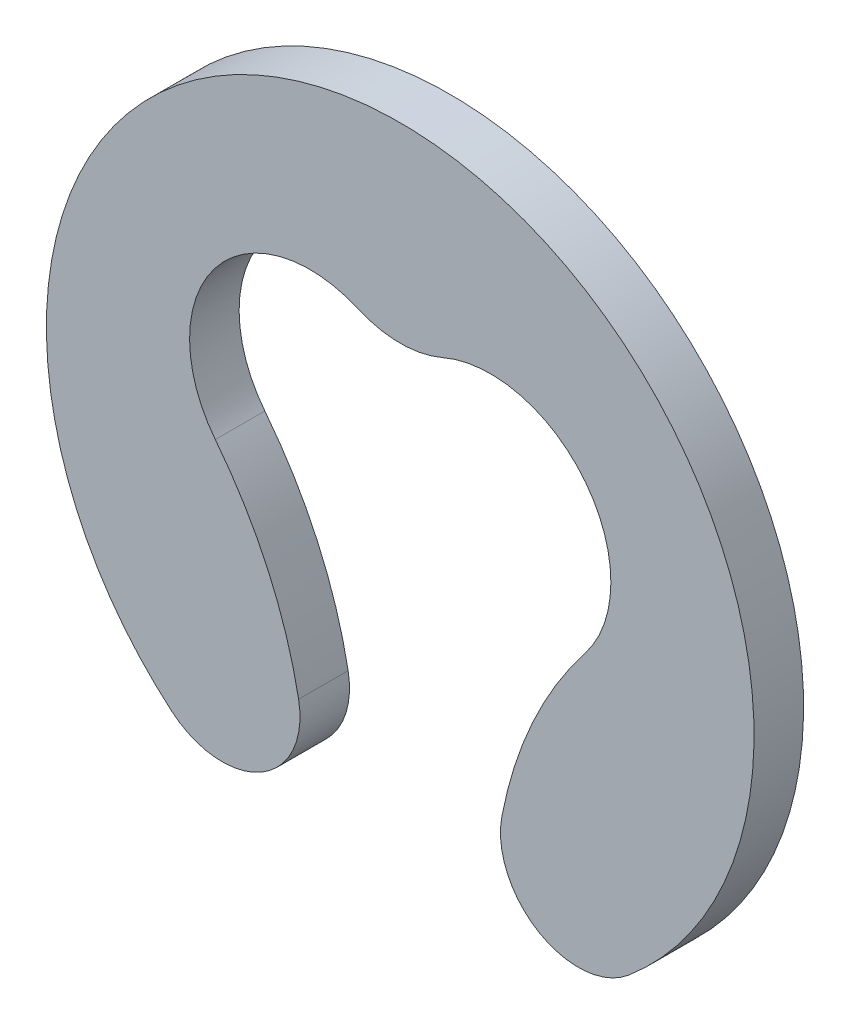
ISO-10303-21;
HEADER;
FILE_DESCRIPTION(('STEP AP214'),'2;1');
FILE_NAME('part.step','',(''),(''),'','','');
FILE_SCHEMA(('AUTOMOTIVE_DESIGN { 1 0 10303 214 1 1 1 1 }'));
ENDSEC;
DATA;
#1=APPLICATION_CONTEXT('core data for automotive mechanical design processes');
#2=APPLICATION_PROTOCOL_DEFINITION('international standard','automotive_design',2000,#1);
#3=PRODUCT_CONTEXT('',#1,'mechanical');
#4=PRODUCT('Part','Part','',(#3));
#5=PRODUCT_RELATED_PRODUCT_CATEGORY('part','',(#4));
#6=PRODUCT_DEFINITION_FORMATION('','',#4);
#7=PRODUCT_DEFINITION_CONTEXT('part definition',#1,'design');
#8=PRODUCT_DEFINITION('design','',#6,#7);
#9=PRODUCT_DEFINITION_SHAPE('','',#8);
#10=(LENGTH_UNIT() NAMED_UNIT(*) SI_UNIT(.MILLI.,.METRE.));
#11=(NAMED_UNIT(*) PLANE_ANGLE_UNIT() SI_UNIT($,.RADIAN.));
#12=(NAMED_UNIT(*) SI_UNIT($,.STERADIAN.) SOLID_ANGLE_UNIT());
#13=UNCERTAINTY_MEASURE_WITH_UNIT(LENGTH_MEASURE(1.E-05),#10,'distance_accuracy_value','');
#14=(GEOMETRIC_REPRESENTATION_CONTEXT(3) GLOBAL_UNCERTAINTY_ASSIGNED_CONTEXT((#13)) GLOBAL_UNIT_ASSIGNED_CONTEXT((#10,
#11,#12)) REPRESENTATION_CONTEXT('',''));
#15=CARTESIAN_POINT('',(0.,0.,0.));
#16=DIRECTION('',(0.,0.,1.));
#17=DIRECTION('',(1.,0.,0.));
#18=AXIS2_PLACEMENT_3D('',#15,#16,#17);
#19=CARTESIAN_POINT('',(0.,0.,0.7));
#20=DIRECTION('',(0.,0.,1.));
#21=DIRECTION('',(1.,0.,0.));
#22=AXIS2_PLACEMENT_3D('',#19,#20,#21);
#23=PLANE('',#22);
#24=CARTESIAN_POINT('',(7.33090114238568,-3.89202883347084,0.7));
#25=DIRECTION('',(0.,0.,-1.));
#26=DIRECTION('',(1.,0.,0.));
#27=AXIS2_PLACEMENT_3D('',#24,#25,#26);
#28=CIRCLE('',#27,6.);
#29=CARTESIAN_POINT('',(1.43590173451363,-2.77445020930684,0.7));
#30=VERTEX_POINT('',#29);
#31=CARTESIAN_POINT('',(2.61328937992658,-0.18471993634512,0.7));
#32=VERTEX_POINT('',#31);
#33=EDGE_CURVE('E146',#30,#32,#28,.T.);
#34=ORIENTED_EDGE('',*,*,#33,.F.);
#35=CARTESIAN_POINT('',(2.51665162595684,-2.97933962373691,0.7));
#36=DIRECTION('',(0.,0.,1.));
#37=DIRECTION('',(1.,0.,0.));
#38=AXIS2_PLACEMENT_3D('',#35,#36,#37);
#39=CIRCLE('',#38,1.1);
#40=CARTESIAN_POINT('',(3.22647644353441,-3.81966618427809,0.7));
#41=VERTEX_POINT('',#40);
#42=EDGE_CURVE('E176',#30,#41,#39,.T.);
#43=ORIENTED_EDGE('',*,*,#42,.T.);
#44=CARTESIAN_POINT('',(0.,0.,0.7));
#45=DIRECTION('',(0.,0.,1.));
#46=DIRECTION('',(1.,0.,0.));
#47=AXIS2_PLACEMENT_3D('',#44,#45,#46);
#48=CIRCLE('',#47,5.);
#49=CARTESIAN_POINT('',(-3.22647644353441,-3.81966618427809,0.7));
#50=VERTEX_POINT('',#49);
#51=EDGE_CURVE('E164',#41,#50,#48,.T.);
#52=ORIENTED_EDGE('',*,*,#51,.T.);
#53=CARTESIAN_POINT('',(-2.51665162595684,-2.97933962373691,0.7));
#54=DIRECTION('',(0.,0.,1.));
#55=DIRECTION('',(1.,0.,0.));
#56=AXIS2_PLACEMENT_3D('',#53,#54,#55);
#57=CIRCLE('',#56,1.1);
#58=CARTESIAN_POINT('',(-1.43590173451363,-2.77445020930684,0.7));
#59=VERTEX_POINT('',#58);
#60=EDGE_CURVE('E173',#50,#59,#57,.T.);
#61=ORIENTED_EDGE('',*,*,#60,.T.);
#62=CARTESIAN_POINT('',(-7.33090114238567,-3.89202883347085,0.7));
#63=DIRECTION('',(0.,0.,-1.));
#64=DIRECTION('',(-1.,0.,0.));
#65=AXIS2_PLACEMENT_3D('',#62,#63,#64);
#66=CIRCLE('',#65,6.);
#67=CARTESIAN_POINT('',(-2.61328937992658,-0.18471993634512,0.7));
#68=VERTEX_POINT('',#67);
#69=EDGE_CURVE('E143',#68,#59,#66,.T.);
#70=ORIENTED_EDGE('',*,*,#69,.F.);
#71=CARTESIAN_POINT('',(-1.2766327138965,0.865684251173833,0.7));
#72=DIRECTION('',(0.,0.,1.));
#73=DIRECTION('',(1.,0.,0.));
#74=AXIS2_PLACEMENT_3D('',#71,#72,#73);
#75=CIRCLE('',#74,1.7);
#76=CARTESIAN_POINT('',(-0.598421584638982,2.42453949273773,0.7));
#77=VERTEX_POINT('',#76);
#78=EDGE_CURVE('E117',#77,#68,#75,.T.);
#79=ORIENTED_EDGE('',*,*,#78,.F.);
#80=CARTESIAN_POINT('',(0.,3.8,0.7));
#81=DIRECTION('',(0.,0.,-1.));
#82=DIRECTION('',(1.,0.,0.));
#83=AXIS2_PLACEMENT_3D('',#80,#81,#82);
#84=CIRCLE('',#83,1.5);
#85=CARTESIAN_POINT('',(0.598421584638982,2.42453949273773,0.7));
#86=VERTEX_POINT('',#85);
#87=EDGE_CURVE('E121',#86,#77,#84,.T.);
#88=ORIENTED_EDGE('',*,*,#87,.F.);
#89=CARTESIAN_POINT('',(1.2766327138965,0.865684251173834,0.7));
#90=DIRECTION('',(0.,0.,1.));
#91=DIRECTION('',(-1.,0.,0.));
#92=AXIS2_PLACEMENT_3D('',#89,#90,#91);
#93=CIRCLE('',#92,1.7);
#94=EDGE_CURVE('E149',#32,#86,#93,.T.);
#95=ORIENTED_EDGE('',*,*,#94,.F.);
#96=EDGE_LOOP('',(#34,#43,#52,#61,#70,#79,#88,#95));
#97=FACE_BOUND('',#96,.T.);
#98=ADVANCED_FACE('F38',(#97),#23,.T.);
#99=CARTESIAN_POINT('',(0.,0.,0.));
#100=DIRECTION('',(0.,0.,1.));
#101=DIRECTION('',(1.,0.,0.));
#102=AXIS2_PLACEMENT_3D('',#99,#100,#101);
#103=PLANE('',#102);
#104=CARTESIAN_POINT('',(0.,0.,0.));
#105=DIRECTION('',(0.,0.,1.));
#106=DIRECTION('',(1.,0.,0.));
#107=AXIS2_PLACEMENT_3D('',#104,#105,#106);
#108=CIRCLE('',#107,5.);
#109=CARTESIAN_POINT('',(3.22647644353441,-3.81966618427809,0.));
#110=VERTEX_POINT('',#109);
#111=CARTESIAN_POINT('',(-3.22647644353441,-3.81966618427809,0.));
#112=VERTEX_POINT('',#111);
#113=EDGE_CURVE('E108',#110,#112,#108,.T.);
#114=ORIENTED_EDGE('',*,*,#113,.F.);
#115=CARTESIAN_POINT('',(2.51665162595684,-2.97933962373691,0.));
#116=DIRECTION('',(0.,0.,1.));
#117=DIRECTION('',(1.,0.,0.));
#118=AXIS2_PLACEMENT_3D('',#115,#116,#117);
#119=CIRCLE('',#118,1.1);
#120=CARTESIAN_POINT('',(1.43590173451363,-2.77445020930684,0.));
#121=VERTEX_POINT('',#120);
#122=EDGE_CURVE('E47',#110,#121,#119,.F.);
#123=ORIENTED_EDGE('',*,*,#122,.T.);
#124=CARTESIAN_POINT('',(7.33090114238568,-3.89202883347084,0.));
#125=DIRECTION('',(0.,0.,1.));
#126=DIRECTION('',(1.,0.,0.));
#127=AXIS2_PLACEMENT_3D('',#124,#125,#126);
#128=CIRCLE('',#127,6.);
#129=CARTESIAN_POINT('',(2.61328937992658,-0.18471993634512,0.));
#130=VERTEX_POINT('',#129);
#131=EDGE_CURVE('E137',#130,#121,#128,.T.);
#132=ORIENTED_EDGE('',*,*,#131,.F.);
#133=CARTESIAN_POINT('',(1.2766327138965,0.865684251173834,0.));
#134=DIRECTION('',(0.,0.,1.));
#135=DIRECTION('',(1.,0.,0.));
#136=AXIS2_PLACEMENT_3D('',#133,#134,#135);
#137=CIRCLE('',#136,1.7);
#138=CARTESIAN_POINT('',(0.598421584638982,2.42453949273773,0.));
#139=VERTEX_POINT('',#138);
#140=EDGE_CURVE('E131',#139,#130,#137,.F.);
#141=ORIENTED_EDGE('',*,*,#140,.F.);
#142=CARTESIAN_POINT('',(0.,3.8,0.));
#143=DIRECTION('',(0.,0.,1.));
#144=DIRECTION('',(1.,0.,0.));
#145=AXIS2_PLACEMENT_3D('',#142,#143,#144);
#146=CIRCLE('',#145,1.5);
#147=CARTESIAN_POINT('',(-0.598421584638982,2.42453949273773,0.));
#148=VERTEX_POINT('',#147);
#149=EDGE_CURVE('E126',#148,#139,#146,.T.);
#150=ORIENTED_EDGE('',*,*,#149,.F.);
#151=CARTESIAN_POINT('',(-1.2766327138965,0.865684251173833,0.));
#152=DIRECTION('',(0.,0.,1.));
#153=DIRECTION('',(1.,0.,0.));
#154=AXIS2_PLACEMENT_3D('',#151,#152,#153);
#155=CIRCLE('',#154,1.7);
#156=CARTESIAN_POINT('',(-2.61328937992658,-0.18471993634512,0.));
#157=VERTEX_POINT('',#156);
#158=EDGE_CURVE('E114',#157,#148,#155,.F.);
#159=ORIENTED_EDGE('',*,*,#158,.F.);
#160=CARTESIAN_POINT('',(-7.33090114238567,-3.89202883347085,0.));
#161=DIRECTION('',(0.,0.,1.));
#162=DIRECTION('',(1.,0.,0.));
#163=AXIS2_PLACEMENT_3D('',#160,#161,#162);
#164=CIRCLE('',#163,6.);
#165=CARTESIAN_POINT('',(-1.43590173451363,-2.77445020930684,0.));
#166=VERTEX_POINT('',#165);
#167=EDGE_CURVE('E101',#166,#157,#164,.T.);
#168=ORIENTED_EDGE('',*,*,#167,.F.);
#169=CARTESIAN_POINT('',(-2.51665162595684,-2.97933962373691,0.));
#170=DIRECTION('',(0.,0.,1.));
#171=DIRECTION('',(1.,0.,0.));
#172=AXIS2_PLACEMENT_3D('',#169,#170,#171);
#173=CIRCLE('',#172,1.1);
#174=EDGE_CURVE('E59',#166,#112,#173,.F.);
#175=ORIENTED_EDGE('',*,*,#174,.T.);
#176=EDGE_LOOP('',(#114,#123,#132,#141,#150,#159,#168,#175));
#177=FACE_BOUND('',#176,.T.);
#178=ADVANCED_FACE('F123',(#177),#103,.F.);
#179=CARTESIAN_POINT('',(0.,0.,0.7));
#180=DIRECTION('',(0.,0.,-1.));
#181=DIRECTION('',(-1.,0.,0.));
#182=AXIS2_PLACEMENT_3D('',#179,#180,#181);
#183=CYLINDRICAL_SURFACE('',#182,5.);
#184=ORIENTED_EDGE('',*,*,#51,.F.);
#185=DIRECTION('',(0.,0.,-1.));
#186=VECTOR('',#185,1.);
#187=CARTESIAN_POINT('',(3.22647644353441,-3.81966618427809,0.7));
#188=LINE('',#187,#186);
#189=EDGE_CURVE('E183',#41,#110,#188,.T.);
#190=ORIENTED_EDGE('',*,*,#189,.T.);
#191=ORIENTED_EDGE('',*,*,#113,.T.);
#192=DIRECTION('',(0.,0.,-1.));
#193=VECTOR('',#192,1.);
#194=CARTESIAN_POINT('',(-3.22647644353441,-3.81966618427809,0.7));
#195=LINE('',#194,#193);
#196=EDGE_CURVE('E179',#112,#50,#195,.F.);
#197=ORIENTED_EDGE('',*,*,#196,.T.);
#198=EDGE_LOOP('',(#184,#190,#191,#197));
#199=FACE_BOUND('',#198,.T.);
#200=ADVANCED_FACE('F201',(#199),#183,.T.);
#201=CARTESIAN_POINT('',(-1.2766327138965,0.865684251173833,-0.00100000000000002));
#202=DIRECTION('',(0.,0.,1.));
#203=DIRECTION('',(1.,0.,0.));
#204=AXIS2_PLACEMENT_3D('',#201,#202,#203);
#205=CYLINDRICAL_SURFACE('',#204,1.7);
#206=ORIENTED_EDGE('',*,*,#158,.T.);
#207=DIRECTION('',(0.,0.,1.));
#208=VECTOR('',#207,1.);
#209=CARTESIAN_POINT('',(-0.598421584638982,2.42453949273773,-0.00100000000000002));
#210=LINE('',#209,#208);
#211=EDGE_CURVE('E109',#148,#77,#210,.T.);
#212=ORIENTED_EDGE('',*,*,#211,.T.);
#213=ORIENTED_EDGE('',*,*,#78,.T.);
#214=DIRECTION('',(0.,0.,1.));
#215=VECTOR('',#214,1.);
#216=CARTESIAN_POINT('',(-2.61328937992658,-0.18471993634512,-0.00100000000000002));
#217=LINE('',#216,#215);
#218=EDGE_CURVE('E104',#157,#68,#217,.T.);
#219=ORIENTED_EDGE('',*,*,#218,.F.);
#220=EDGE_LOOP('',(#206,#212,#213,#219));
#221=FACE_BOUND('',#220,.T.);
#222=ADVANCED_FACE('F113',(#221),#205,.F.);
#223=CARTESIAN_POINT('',(0.,3.8,-0.00100000000000002));
#224=DIRECTION('',(0.,0.,1.));
#225=DIRECTION('',(1.,0.,0.));
#226=AXIS2_PLACEMENT_3D('',#223,#224,#225);
#227=CYLINDRICAL_SURFACE('',#226,1.5);
#228=ORIENTED_EDGE('',*,*,#149,.T.);
#229=DIRECTION('',(0.,0.,1.));
#230=VECTOR('',#229,1.);
#231=CARTESIAN_POINT('',(0.598421584638982,2.42453949273773,-0.00100000000000002));
#232=LINE('',#231,#230);
#233=EDGE_CURVE('E158',#139,#86,#232,.T.);
#234=ORIENTED_EDGE('',*,*,#233,.T.);
#235=ORIENTED_EDGE('',*,*,#87,.T.);
#236=ORIENTED_EDGE('',*,*,#211,.F.);
#237=EDGE_LOOP('',(#228,#234,#235,#236));
#238=FACE_BOUND('',#237,.T.);
#239=ADVANCED_FACE('F206',(#238),#227,.T.);
#240=CARTESIAN_POINT('',(1.2766327138965,0.865684251173834,-0.00100000000000002));
#241=DIRECTION('',(0.,0.,1.));
#242=DIRECTION('',(1.,0.,0.));
#243=AXIS2_PLACEMENT_3D('',#240,#241,#242);
#244=CYLINDRICAL_SURFACE('',#243,1.7);
#245=ORIENTED_EDGE('',*,*,#140,.T.);
#246=DIRECTION('',(0.,0.,1.));
#247=VECTOR('',#246,1.);
#248=CARTESIAN_POINT('',(2.61328937992658,-0.18471993634512,-0.00100000000000002));
#249=LINE('',#248,#247);
#250=EDGE_CURVE('E120',#130,#32,#249,.T.);
#251=ORIENTED_EDGE('',*,*,#250,.T.);
#252=ORIENTED_EDGE('',*,*,#94,.T.);
#253=ORIENTED_EDGE('',*,*,#233,.F.);
#254=EDGE_LOOP('',(#245,#251,#252,#253));
#255=FACE_BOUND('',#254,.T.);
#256=ADVANCED_FACE('F208',(#255),#244,.F.);
#257=CARTESIAN_POINT('',(7.33090114238568,-3.89202883347084,-0.00100000000000002));
#258=DIRECTION('',(0.,0.,1.));
#259=DIRECTION('',(1.,0.,0.));
#260=AXIS2_PLACEMENT_3D('',#257,#258,#259);
#261=CYLINDRICAL_SURFACE('',#260,6.);
#262=ORIENTED_EDGE('',*,*,#131,.T.);
#263=DIRECTION('',(0.,0.,1.));
#264=VECTOR('',#263,1.);
#265=CARTESIAN_POINT('',(1.43590173451363,-2.77445020930684,-0.00100000000000002));
#266=LINE('',#265,#264);
#267=EDGE_CURVE('E168',#121,#30,#266,.T.);
#268=ORIENTED_EDGE('',*,*,#267,.T.);
#269=ORIENTED_EDGE('',*,*,#33,.T.);
#270=ORIENTED_EDGE('',*,*,#250,.F.);
#271=EDGE_LOOP('',(#262,#268,#269,#270));
#272=FACE_BOUND('',#271,.T.);
#273=ADVANCED_FACE('F194',(#272),#261,.T.);
#274=CARTESIAN_POINT('',(-7.33090114238567,-3.89202883347085,-0.00100000000000002));
#275=DIRECTION('',(0.,0.,1.));
#276=DIRECTION('',(1.,0.,0.));
#277=AXIS2_PLACEMENT_3D('',#274,#275,#276);
#278=CYLINDRICAL_SURFACE('',#277,6.);
#279=ORIENTED_EDGE('',*,*,#69,.T.);
#280=DIRECTION('',(0.,0.,1.));
#281=VECTOR('',#280,1.);
#282=CARTESIAN_POINT('',(-1.43590173451363,-2.77445020930684,-0.00100000000000002));
#283=LINE('',#282,#281);
#284=EDGE_CURVE('E11',#59,#166,#283,.F.);
#285=ORIENTED_EDGE('',*,*,#284,.T.);
#286=ORIENTED_EDGE('',*,*,#167,.T.);
#287=ORIENTED_EDGE('',*,*,#218,.T.);
#288=EDGE_LOOP('',(#279,#285,#286,#287));
#289=FACE_BOUND('',#288,.T.);
#290=ADVANCED_FACE('F103',(#289),#278,.T.);
#291=CARTESIAN_POINT('',(2.51665162595684,-2.97933962373691,0.7));
#292=DIRECTION('',(0.,0.,1.));
#293=DIRECTION('',(1.,0.,0.));
#294=AXIS2_PLACEMENT_3D('',#291,#292,#293);
#295=CYLINDRICAL_SURFACE('',#294,1.1);
#296=ORIENTED_EDGE('',*,*,#122,.F.);
#297=ORIENTED_EDGE('',*,*,#189,.F.);
#298=ORIENTED_EDGE('',*,*,#42,.F.);
#299=ORIENTED_EDGE('',*,*,#267,.F.);
#300=EDGE_LOOP('',(#296,#297,#298,#299));
#301=FACE_BOUND('',#300,.T.);
#302=ADVANCED_FACE('F196',(#301),#295,.T.);
#303=CARTESIAN_POINT('',(-2.51665162595684,-2.97933962373691,-0.00100000000000002));
#304=DIRECTION('',(0.,0.,1.));
#305=DIRECTION('',(1.,0.,0.));
#306=AXIS2_PLACEMENT_3D('',#303,#304,#305);
#307=CYLINDRICAL_SURFACE('',#306,1.1);
#308=ORIENTED_EDGE('',*,*,#174,.F.);
#309=ORIENTED_EDGE('',*,*,#284,.F.);
#310=ORIENTED_EDGE('',*,*,#60,.F.);
#311=ORIENTED_EDGE('',*,*,#196,.F.);
#312=EDGE_LOOP('',(#308,#309,#310,#311));
#313=FACE_BOUND('',#312,.T.);
#314=ADVANCED_FACE('F40',(#313),#307,.T.);
#315=CLOSED_SHELL('',(#98,#178,#200,#222,#239,#256,#273,#290,#302,#314));
#316=MANIFOLD_SOLID_BREP('B2',#315);
#317=ADVANCED_BREP_SHAPE_REPRESENTATION('',(#18,#316),#14);
#318=SHAPE_DEFINITION_REPRESENTATION(#9,#317);
ENDSEC;
END-ISO-10303-21;
